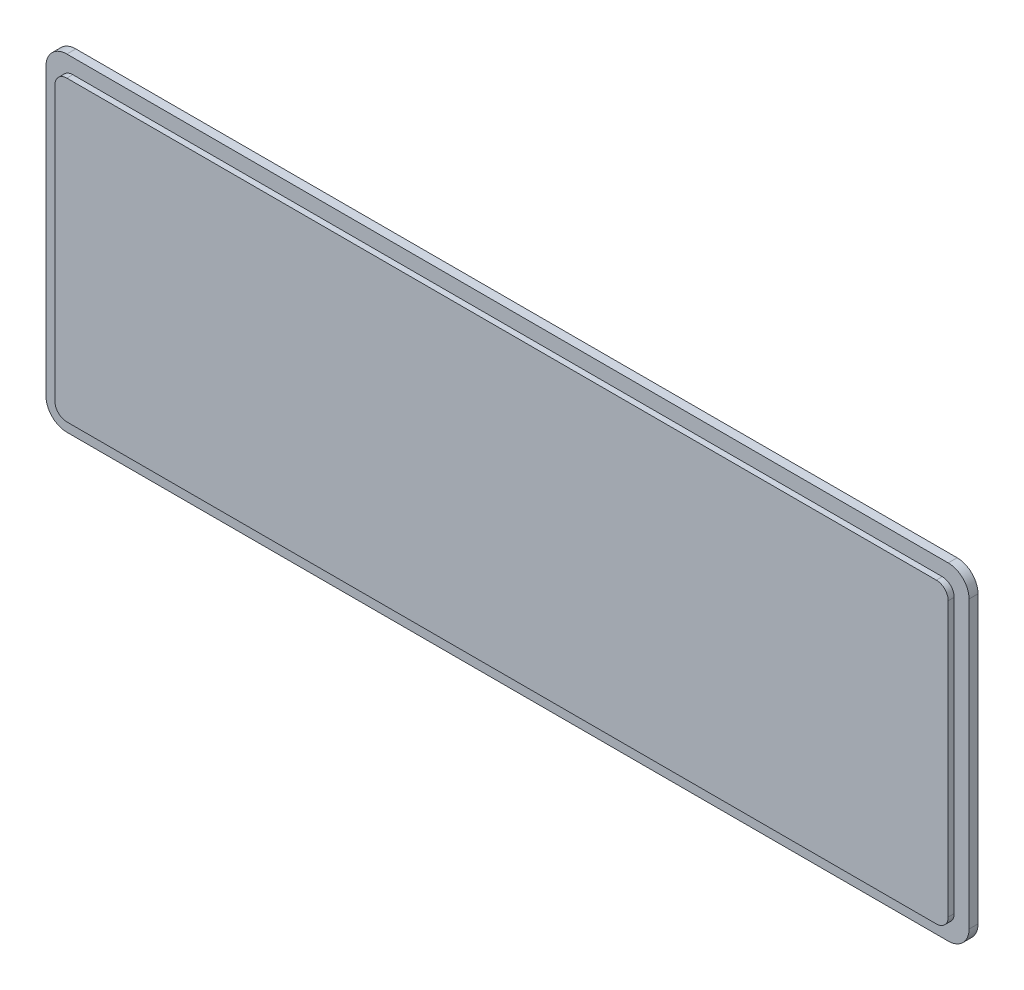
ISO-10303-21;
HEADER;
FILE_DESCRIPTION(('STEP AP214'),'2;1');
FILE_NAME('part.step','',(''),(''),'','','');
FILE_SCHEMA(('AUTOMOTIVE_DESIGN { 1 0 10303 214 1 1 1 1 }'));
ENDSEC;
DATA;
#1=APPLICATION_CONTEXT('core data for automotive mechanical design processes');
#2=APPLICATION_PROTOCOL_DEFINITION('international standard','automotive_design',2000,#1);
#3=PRODUCT_CONTEXT('',#1,'mechanical');
#4=PRODUCT('Part','Part','',(#3));
#5=PRODUCT_RELATED_PRODUCT_CATEGORY('part','',(#4));
#6=PRODUCT_DEFINITION_FORMATION('','',#4);
#7=PRODUCT_DEFINITION_CONTEXT('part definition',#1,'design');
#8=PRODUCT_DEFINITION('design','',#6,#7);
#9=PRODUCT_DEFINITION_SHAPE('','',#8);
#10=(LENGTH_UNIT() NAMED_UNIT(*) SI_UNIT(.MILLI.,.METRE.));
#11=(NAMED_UNIT(*) PLANE_ANGLE_UNIT() SI_UNIT($,.RADIAN.));
#12=(NAMED_UNIT(*) SI_UNIT($,.STERADIAN.) SOLID_ANGLE_UNIT());
#13=UNCERTAINTY_MEASURE_WITH_UNIT(LENGTH_MEASURE(1.E-05),#10,'distance_accuracy_value','');
#14=(GEOMETRIC_REPRESENTATION_CONTEXT(3) GLOBAL_UNCERTAINTY_ASSIGNED_CONTEXT((#13)) GLOBAL_UNIT_ASSIGNED_CONTEXT((#10,
#11,#12)) REPRESENTATION_CONTEXT('',''));
#15=CARTESIAN_POINT('',(0.,0.,0.));
#16=DIRECTION('',(0.,0.,1.));
#17=DIRECTION('',(1.,0.,0.));
#18=AXIS2_PLACEMENT_3D('',#15,#16,#17);
#19=CARTESIAN_POINT('',(0.,0.,1.5));
#20=DIRECTION('',(1.,0.,0.));
#21=DIRECTION('',(0.,1.,0.));
#22=AXIS2_PLACEMENT_3D('',#19,#20,#21);
#23=PLANE('',#22);
#24=DIRECTION('',(0.,-1.,0.));
#25=VECTOR('',#24,1.);
#26=CARTESIAN_POINT('',(0.,0.,0.));
#27=LINE('',#26,#25);
#28=CARTESIAN_POINT('',(0.,-3.5,0.));
#29=VERTEX_POINT('',#28);
#30=CARTESIAN_POINT('',(0.,-51.5,0.));
#31=VERTEX_POINT('',#30);
#32=EDGE_CURVE('E174',#29,#31,#27,.T.);
#33=ORIENTED_EDGE('',*,*,#32,.T.);
#34=DIRECTION('',(0.,0.,-1.));
#35=VECTOR('',#34,1.);
#36=CARTESIAN_POINT('',(0.,-51.5,1.5));
#37=LINE('',#36,#35);
#38=CARTESIAN_POINT('',(0.,-51.5,1.5));
#39=VERTEX_POINT('',#38);
#40=EDGE_CURVE('E152',#31,#39,#37,.F.);
#41=ORIENTED_EDGE('',*,*,#40,.T.);
#42=DIRECTION('',(0.,-1.,0.));
#43=VECTOR('',#42,1.);
#44=CARTESIAN_POINT('',(0.,0.,1.5));
#45=LINE('',#44,#43);
#46=CARTESIAN_POINT('',(0.,-3.5,1.5));
#47=VERTEX_POINT('',#46);
#48=EDGE_CURVE('E185',#47,#39,#45,.T.);
#49=ORIENTED_EDGE('',*,*,#48,.F.);
#50=DIRECTION('',(0.,0.,-1.));
#51=VECTOR('',#50,1.);
#52=CARTESIAN_POINT('',(0.,-3.5,1.5));
#53=LINE('',#52,#51);
#54=EDGE_CURVE('E157',#47,#29,#53,.T.);
#55=ORIENTED_EDGE('',*,*,#54,.T.);
#56=EDGE_LOOP('',(#33,#41,#49,#55));
#57=FACE_BOUND('',#56,.T.);
#58=ADVANCED_FACE('F35',(#57),#23,.F.);
#59=CARTESIAN_POINT('',(0.,-55.,1.5));
#60=DIRECTION('',(0.,1.,0.));
#61=DIRECTION('',(0.,0.,1.));
#62=AXIS2_PLACEMENT_3D('',#59,#60,#61);
#63=PLANE('',#62);
#64=DIRECTION('',(1.,0.,0.));
#65=VECTOR('',#64,1.);
#66=CARTESIAN_POINT('',(0.,-55.,1.5));
#67=LINE('',#66,#65);
#68=CARTESIAN_POINT('',(3.50000000000001,-55.,1.5));
#69=VERTEX_POINT('',#68);
#70=CARTESIAN_POINT('',(151.5,-55.,1.5));
#71=VERTEX_POINT('',#70);
#72=EDGE_CURVE('E167',#69,#71,#67,.T.);
#73=ORIENTED_EDGE('',*,*,#72,.F.);
#74=DIRECTION('',(0.,0.,-1.));
#75=VECTOR('',#74,1.);
#76=CARTESIAN_POINT('',(3.50000000000001,-55.,1.5));
#77=LINE('',#76,#75);
#78=CARTESIAN_POINT('',(3.50000000000001,-55.,0.));
#79=VERTEX_POINT('',#78);
#80=EDGE_CURVE('E151',#69,#79,#77,.T.);
#81=ORIENTED_EDGE('',*,*,#80,.T.);
#82=DIRECTION('',(1.,0.,0.));
#83=VECTOR('',#82,1.);
#84=CARTESIAN_POINT('',(0.,-55.,0.));
#85=LINE('',#84,#83);
#86=CARTESIAN_POINT('',(151.5,-55.,0.));
#87=VERTEX_POINT('',#86);
#88=EDGE_CURVE('E164',#79,#87,#85,.T.);
#89=ORIENTED_EDGE('',*,*,#88,.T.);
#90=DIRECTION('',(0.,0.,-1.));
#91=VECTOR('',#90,1.);
#92=CARTESIAN_POINT('',(151.5,-55.,1.5));
#93=LINE('',#92,#91);
#94=EDGE_CURVE('E169',#87,#71,#93,.F.);
#95=ORIENTED_EDGE('',*,*,#94,.T.);
#96=EDGE_LOOP('',(#73,#81,#89,#95));
#97=FACE_BOUND('',#96,.T.);
#98=ADVANCED_FACE('F163',(#97),#63,.F.);
#99=CARTESIAN_POINT('',(155.,0.,1.5));
#100=DIRECTION('',(-1.,0.,0.));
#101=DIRECTION('',(0.,0.,1.));
#102=AXIS2_PLACEMENT_3D('',#99,#100,#101);
#103=PLANE('',#102);
#104=DIRECTION('',(0.,1.,0.));
#105=VECTOR('',#104,1.);
#106=CARTESIAN_POINT('',(155.,0.,1.5));
#107=LINE('',#106,#105);
#108=CARTESIAN_POINT('',(155.,-51.5,1.5));
#109=VERTEX_POINT('',#108);
#110=CARTESIAN_POINT('',(155.,-3.5,1.5));
#111=VERTEX_POINT('',#110);
#112=EDGE_CURVE('E285',#109,#111,#107,.T.);
#113=ORIENTED_EDGE('',*,*,#112,.F.);
#114=DIRECTION('',(0.,0.,-1.));
#115=VECTOR('',#114,1.);
#116=CARTESIAN_POINT('',(155.,-51.5,1.5));
#117=LINE('',#116,#115);
#118=CARTESIAN_POINT('',(155.,-51.5,0.));
#119=VERTEX_POINT('',#118);
#120=EDGE_CURVE('E205',#109,#119,#117,.T.);
#121=ORIENTED_EDGE('',*,*,#120,.T.);
#122=DIRECTION('',(0.,1.,0.));
#123=VECTOR('',#122,1.);
#124=CARTESIAN_POINT('',(155.,0.,0.));
#125=LINE('',#124,#123);
#126=CARTESIAN_POINT('',(155.,-3.5,0.));
#127=VERTEX_POINT('',#126);
#128=EDGE_CURVE('E173',#119,#127,#125,.T.);
#129=ORIENTED_EDGE('',*,*,#128,.T.);
#130=DIRECTION('',(0.,0.,-1.));
#131=VECTOR('',#130,1.);
#132=CARTESIAN_POINT('',(155.,-3.5,1.5));
#133=LINE('',#132,#131);
#134=EDGE_CURVE('E203',#127,#111,#133,.F.);
#135=ORIENTED_EDGE('',*,*,#134,.T.);
#136=EDGE_LOOP('',(#113,#121,#129,#135));
#137=FACE_BOUND('',#136,.T.);
#138=ADVANCED_FACE('F306',(#137),#103,.F.);
#139=CARTESIAN_POINT('',(0.,0.,1.5));
#140=DIRECTION('',(0.,-1.,0.));
#141=DIRECTION('',(0.,0.,-1.));
#142=AXIS2_PLACEMENT_3D('',#139,#140,#141);
#143=PLANE('',#142);
#144=DIRECTION('',(-1.,0.,0.));
#145=VECTOR('',#144,1.);
#146=CARTESIAN_POINT('',(0.,0.,1.5));
#147=LINE('',#146,#145);
#148=CARTESIAN_POINT('',(151.5,0.,1.5));
#149=VERTEX_POINT('',#148);
#150=CARTESIAN_POINT('',(3.5,0.,1.5));
#151=VERTEX_POINT('',#150);
#152=EDGE_CURVE('E186',#149,#151,#147,.T.);
#153=ORIENTED_EDGE('',*,*,#152,.F.);
#154=DIRECTION('',(0.,0.,-1.));
#155=VECTOR('',#154,1.);
#156=CARTESIAN_POINT('',(151.5,0.,1.5));
#157=LINE('',#156,#155);
#158=CARTESIAN_POINT('',(151.5,0.,0.));
#159=VERTEX_POINT('',#158);
#160=EDGE_CURVE('E210',#149,#159,#157,.T.);
#161=ORIENTED_EDGE('',*,*,#160,.T.);
#162=DIRECTION('',(-1.,0.,0.));
#163=VECTOR('',#162,1.);
#164=CARTESIAN_POINT('',(0.,0.,0.));
#165=LINE('',#164,#163);
#166=CARTESIAN_POINT('',(3.5,0.,0.));
#167=VERTEX_POINT('',#166);
#168=EDGE_CURVE('E177',#159,#167,#165,.T.);
#169=ORIENTED_EDGE('',*,*,#168,.T.);
#170=DIRECTION('',(0.,0.,-1.));
#171=VECTOR('',#170,1.);
#172=CARTESIAN_POINT('',(3.5,0.,1.5));
#173=LINE('',#172,#171);
#174=EDGE_CURVE('E208',#167,#151,#173,.F.);
#175=ORIENTED_EDGE('',*,*,#174,.T.);
#176=EDGE_LOOP('',(#153,#161,#169,#175));
#177=FACE_BOUND('',#176,.T.);
#178=ADVANCED_FACE('F300',(#177),#143,.F.);
#179=CARTESIAN_POINT('',(0.,0.,1.5));
#180=DIRECTION('',(0.,0.,1.));
#181=DIRECTION('',(1.,0.,0.));
#182=AXIS2_PLACEMENT_3D('',#179,#180,#181);
#183=PLANE('',#182);
#184=DIRECTION('',(0.,-1.,0.));
#185=VECTOR('',#184,1.);
#186=CARTESIAN_POINT('',(2.5,-2.5,1.5));
#187=LINE('',#186,#185);
#188=CARTESIAN_POINT('',(2.5,-4.5,1.5));
#189=VERTEX_POINT('',#188);
#190=CARTESIAN_POINT('',(2.5,-50.5,1.5));
#191=VERTEX_POINT('',#190);
#192=EDGE_CURVE('E247',#189,#191,#187,.T.);
#193=ORIENTED_EDGE('',*,*,#192,.F.);
#194=CARTESIAN_POINT('',(4.5,-4.5,1.5));
#195=DIRECTION('',(0.,0.,1.));
#196=DIRECTION('',(1.,0.,0.));
#197=AXIS2_PLACEMENT_3D('',#194,#195,#196);
#198=CIRCLE('',#197,2.);
#199=CARTESIAN_POINT('',(4.5,-2.5,1.5));
#200=VERTEX_POINT('',#199);
#201=EDGE_CURVE('E242',#189,#200,#198,.F.);
#202=ORIENTED_EDGE('',*,*,#201,.T.);
#203=DIRECTION('',(-1.,0.,0.));
#204=VECTOR('',#203,1.);
#205=CARTESIAN_POINT('',(2.5,-2.5,1.5));
#206=LINE('',#205,#204);
#207=CARTESIAN_POINT('',(150.5,-2.5,1.5));
#208=VERTEX_POINT('',#207);
#209=EDGE_CURVE('E271',#208,#200,#206,.T.);
#210=ORIENTED_EDGE('',*,*,#209,.F.);
#211=CARTESIAN_POINT('',(150.5,-4.5,1.5));
#212=DIRECTION('',(0.,0.,1.));
#213=DIRECTION('',(1.,0.,0.));
#214=AXIS2_PLACEMENT_3D('',#211,#212,#213);
#215=CIRCLE('',#214,2.);
#216=CARTESIAN_POINT('',(152.5,-4.5,1.5));
#217=VERTEX_POINT('',#216);
#218=EDGE_CURVE('E240',#208,#217,#215,.F.);
#219=ORIENTED_EDGE('',*,*,#218,.T.);
#220=DIRECTION('',(0.,1.,0.));
#221=VECTOR('',#220,1.);
#222=CARTESIAN_POINT('',(152.5,-2.5,1.5));
#223=LINE('',#222,#221);
#224=CARTESIAN_POINT('',(152.5,-50.5,1.5));
#225=VERTEX_POINT('',#224);
#226=EDGE_CURVE('E277',#225,#217,#223,.T.);
#227=ORIENTED_EDGE('',*,*,#226,.F.);
#228=CARTESIAN_POINT('',(150.5,-50.5,1.5));
#229=DIRECTION('',(0.,0.,1.));
#230=DIRECTION('',(1.,0.,0.));
#231=AXIS2_PLACEMENT_3D('',#228,#229,#230);
#232=CIRCLE('',#231,2.);
#233=CARTESIAN_POINT('',(150.5,-52.5,1.5));
#234=VERTEX_POINT('',#233);
#235=EDGE_CURVE('E11',#225,#234,#232,.F.);
#236=ORIENTED_EDGE('',*,*,#235,.T.);
#237=DIRECTION('',(1.,0.,0.));
#238=VECTOR('',#237,1.);
#239=CARTESIAN_POINT('',(2.5,-52.5,1.5));
#240=LINE('',#239,#238);
#241=CARTESIAN_POINT('',(4.5,-52.5,1.5));
#242=VERTEX_POINT('',#241);
#243=EDGE_CURVE('E248',#242,#234,#240,.T.);
#244=ORIENTED_EDGE('',*,*,#243,.F.);
#245=CARTESIAN_POINT('',(4.5,-50.5,1.5));
#246=DIRECTION('',(0.,0.,1.));
#247=DIRECTION('',(1.,0.,0.));
#248=AXIS2_PLACEMENT_3D('',#245,#246,#247);
#249=CIRCLE('',#248,2.);
#250=EDGE_CURVE('E43',#242,#191,#249,.F.);
#251=ORIENTED_EDGE('',*,*,#250,.T.);
#252=EDGE_LOOP('',(#193,#202,#210,#219,#227,#236,#244,#251));
#253=FACE_BOUND('',#252,.T.);
#254=ORIENTED_EDGE('',*,*,#48,.T.);
#255=CARTESIAN_POINT('',(3.50000000000001,-51.5,1.5));
#256=DIRECTION('',(0.,0.,1.));
#257=DIRECTION('',(1.,0.,0.));
#258=AXIS2_PLACEMENT_3D('',#255,#256,#257);
#259=CIRCLE('',#258,3.5);
#260=EDGE_CURVE('E201',#39,#69,#259,.T.);
#261=ORIENTED_EDGE('',*,*,#260,.T.);
#262=ORIENTED_EDGE('',*,*,#72,.T.);
#263=CARTESIAN_POINT('',(151.5,-51.5,1.5));
#264=DIRECTION('',(0.,0.,1.));
#265=DIRECTION('',(1.,0.,0.));
#266=AXIS2_PLACEMENT_3D('',#263,#264,#265);
#267=CIRCLE('',#266,3.5);
#268=EDGE_CURVE('E199',#71,#109,#267,.T.);
#269=ORIENTED_EDGE('',*,*,#268,.T.);
#270=ORIENTED_EDGE('',*,*,#112,.T.);
#271=CARTESIAN_POINT('',(151.5,-3.5,1.5));
#272=DIRECTION('',(0.,0.,1.));
#273=DIRECTION('',(1.,0.,0.));
#274=AXIS2_PLACEMENT_3D('',#271,#272,#273);
#275=CIRCLE('',#274,3.5);
#276=EDGE_CURVE('E197',#111,#149,#275,.T.);
#277=ORIENTED_EDGE('',*,*,#276,.T.);
#278=ORIENTED_EDGE('',*,*,#152,.T.);
#279=CARTESIAN_POINT('',(3.5,-3.5,1.5));
#280=DIRECTION('',(0.,0.,1.));
#281=DIRECTION('',(1.,0.,0.));
#282=AXIS2_PLACEMENT_3D('',#279,#280,#281);
#283=CIRCLE('',#282,3.5);
#284=EDGE_CURVE('E195',#151,#47,#283,.T.);
#285=ORIENTED_EDGE('',*,*,#284,.T.);
#286=EDGE_LOOP('',(#254,#261,#262,#269,#270,#277,#278,#285));
#287=FACE_BOUND('',#286,.T.);
#288=ADVANCED_FACE('F245',(#253,#287),#183,.T.);
#289=CARTESIAN_POINT('',(0.,0.,0.));
#290=DIRECTION('',(0.,0.,1.));
#291=DIRECTION('',(1.,0.,0.));
#292=AXIS2_PLACEMENT_3D('',#289,#290,#291);
#293=PLANE('',#292);
#294=ORIENTED_EDGE('',*,*,#88,.F.);
#295=CARTESIAN_POINT('',(3.50000000000001,-51.5,0.));
#296=DIRECTION('',(0.,0.,1.));
#297=DIRECTION('',(1.,0.,0.));
#298=AXIS2_PLACEMENT_3D('',#295,#296,#297);
#299=CIRCLE('',#298,3.5);
#300=EDGE_CURVE('E147',#79,#31,#299,.F.);
#301=ORIENTED_EDGE('',*,*,#300,.T.);
#302=ORIENTED_EDGE('',*,*,#32,.F.);
#303=CARTESIAN_POINT('',(3.5,-3.5,0.));
#304=DIRECTION('',(0.,0.,1.));
#305=DIRECTION('',(1.,0.,0.));
#306=AXIS2_PLACEMENT_3D('',#303,#304,#305);
#307=CIRCLE('',#306,3.5);
#308=EDGE_CURVE('E168',#29,#167,#307,.F.);
#309=ORIENTED_EDGE('',*,*,#308,.T.);
#310=ORIENTED_EDGE('',*,*,#168,.F.);
#311=CARTESIAN_POINT('',(151.5,-3.5,0.));
#312=DIRECTION('',(0.,0.,1.));
#313=DIRECTION('',(1.,0.,0.));
#314=AXIS2_PLACEMENT_3D('',#311,#312,#313);
#315=CIRCLE('',#314,3.5);
#316=EDGE_CURVE('E189',#159,#127,#315,.F.);
#317=ORIENTED_EDGE('',*,*,#316,.T.);
#318=ORIENTED_EDGE('',*,*,#128,.F.);
#319=CARTESIAN_POINT('',(151.5,-51.5,0.));
#320=DIRECTION('',(0.,0.,1.));
#321=DIRECTION('',(1.,0.,0.));
#322=AXIS2_PLACEMENT_3D('',#319,#320,#321);
#323=CIRCLE('',#322,3.5);
#324=EDGE_CURVE('E158',#119,#87,#323,.F.);
#325=ORIENTED_EDGE('',*,*,#324,.T.);
#326=EDGE_LOOP('',(#294,#301,#302,#309,#310,#317,#318,#325));
#327=FACE_BOUND('',#326,.T.);
#328=ADVANCED_FACE('F171',(#327),#293,.F.);
#329=CARTESIAN_POINT('',(3.50000000000001,-51.5,1.5));
#330=DIRECTION('',(0.,0.,-1.));
#331=DIRECTION('',(-1.,0.,0.));
#332=AXIS2_PLACEMENT_3D('',#329,#330,#331);
#333=CYLINDRICAL_SURFACE('',#332,3.5);
#334=ORIENTED_EDGE('',*,*,#260,.F.);
#335=ORIENTED_EDGE('',*,*,#40,.F.);
#336=ORIENTED_EDGE('',*,*,#300,.F.);
#337=ORIENTED_EDGE('',*,*,#80,.F.);
#338=EDGE_LOOP('',(#334,#335,#336,#337));
#339=FACE_BOUND('',#338,.T.);
#340=ADVANCED_FACE('F150',(#339),#333,.T.);
#341=CARTESIAN_POINT('',(151.5,-51.5,1.5));
#342=DIRECTION('',(0.,0.,-1.));
#343=DIRECTION('',(-1.,0.,0.));
#344=AXIS2_PLACEMENT_3D('',#341,#342,#343);
#345=CYLINDRICAL_SURFACE('',#344,3.5);
#346=ORIENTED_EDGE('',*,*,#268,.F.);
#347=ORIENTED_EDGE('',*,*,#94,.F.);
#348=ORIENTED_EDGE('',*,*,#324,.F.);
#349=ORIENTED_EDGE('',*,*,#120,.F.);
#350=EDGE_LOOP('',(#346,#347,#348,#349));
#351=FACE_BOUND('',#350,.T.);
#352=ADVANCED_FACE('F310',(#351),#345,.T.);
#353=CARTESIAN_POINT('',(151.5,-3.5,1.5));
#354=DIRECTION('',(0.,0.,-1.));
#355=DIRECTION('',(-1.,0.,0.));
#356=AXIS2_PLACEMENT_3D('',#353,#354,#355);
#357=CYLINDRICAL_SURFACE('',#356,3.5);
#358=ORIENTED_EDGE('',*,*,#276,.F.);
#359=ORIENTED_EDGE('',*,*,#134,.F.);
#360=ORIENTED_EDGE('',*,*,#316,.F.);
#361=ORIENTED_EDGE('',*,*,#160,.F.);
#362=EDGE_LOOP('',(#358,#359,#360,#361));
#363=FACE_BOUND('',#362,.T.);
#364=ADVANCED_FACE('F302',(#363),#357,.T.);
#365=CARTESIAN_POINT('',(3.5,-3.5,1.5));
#366=DIRECTION('',(0.,0.,-1.));
#367=DIRECTION('',(-1.,0.,0.));
#368=AXIS2_PLACEMENT_3D('',#365,#366,#367);
#369=CYLINDRICAL_SURFACE('',#368,3.5);
#370=ORIENTED_EDGE('',*,*,#284,.F.);
#371=ORIENTED_EDGE('',*,*,#174,.F.);
#372=ORIENTED_EDGE('',*,*,#308,.F.);
#373=ORIENTED_EDGE('',*,*,#54,.F.);
#374=EDGE_LOOP('',(#370,#371,#372,#373));
#375=FACE_BOUND('',#374,.T.);
#376=ADVANCED_FACE('F297',(#375),#369,.T.);
#377=CARTESIAN_POINT('',(2.5,-2.5,2.5));
#378=DIRECTION('',(1.,0.,0.));
#379=DIRECTION('',(0.,1.,0.));
#380=AXIS2_PLACEMENT_3D('',#377,#378,#379);
#381=PLANE('',#380);
#382=DIRECTION('',(0.,-1.,0.));
#383=VECTOR('',#382,1.);
#384=CARTESIAN_POINT('',(2.5,-2.5,2.5));
#385=LINE('',#384,#383);
#386=CARTESIAN_POINT('',(2.5,-4.5,2.5));
#387=VERTEX_POINT('',#386);
#388=CARTESIAN_POINT('',(2.5,-50.5,2.5));
#389=VERTEX_POINT('',#388);
#390=EDGE_CURVE('E264',#387,#389,#385,.T.);
#391=ORIENTED_EDGE('',*,*,#390,.F.);
#392=DIRECTION('',(0.,0.,-1.));
#393=VECTOR('',#392,1.);
#394=CARTESIAN_POINT('',(2.5,-4.5,2.5));
#395=LINE('',#394,#393);
#396=EDGE_CURVE('E233',#387,#189,#395,.T.);
#397=ORIENTED_EDGE('',*,*,#396,.T.);
#398=ORIENTED_EDGE('',*,*,#192,.T.);
#399=DIRECTION('',(0.,0.,-1.));
#400=VECTOR('',#399,1.);
#401=CARTESIAN_POINT('',(2.5,-50.5,2.5));
#402=LINE('',#401,#400);
#403=EDGE_CURVE('E231',#191,#389,#402,.F.);
#404=ORIENTED_EDGE('',*,*,#403,.T.);
#405=EDGE_LOOP('',(#391,#397,#398,#404));
#406=FACE_BOUND('',#405,.T.);
#407=ADVANCED_FACE('F251',(#406),#381,.F.);
#408=CARTESIAN_POINT('',(2.5,-52.5,2.5));
#409=DIRECTION('',(0.,1.,0.));
#410=DIRECTION('',(0.,0.,1.));
#411=AXIS2_PLACEMENT_3D('',#408,#409,#410);
#412=PLANE('',#411);
#413=DIRECTION('',(1.,0.,0.));
#414=VECTOR('',#413,1.);
#415=CARTESIAN_POINT('',(2.5,-52.5,2.5));
#416=LINE('',#415,#414);
#417=CARTESIAN_POINT('',(4.5,-52.5,2.5));
#418=VERTEX_POINT('',#417);
#419=CARTESIAN_POINT('',(150.5,-52.5,2.5));
#420=VERTEX_POINT('',#419);
#421=EDGE_CURVE('E262',#418,#420,#416,.T.);
#422=ORIENTED_EDGE('',*,*,#421,.F.);
#423=DIRECTION('',(0.,0.,-1.));
#424=VECTOR('',#423,1.);
#425=CARTESIAN_POINT('',(4.5,-52.5,2.5));
#426=LINE('',#425,#424);
#427=EDGE_CURVE('E238',#418,#242,#426,.T.);
#428=ORIENTED_EDGE('',*,*,#427,.T.);
#429=ORIENTED_EDGE('',*,*,#243,.T.);
#430=DIRECTION('',(0.,0.,-1.));
#431=VECTOR('',#430,1.);
#432=CARTESIAN_POINT('',(150.5,-52.5,2.5));
#433=LINE('',#432,#431);
#434=EDGE_CURVE('E236',#234,#420,#433,.F.);
#435=ORIENTED_EDGE('',*,*,#434,.T.);
#436=EDGE_LOOP('',(#422,#428,#429,#435));
#437=FACE_BOUND('',#436,.T.);
#438=ADVANCED_FACE('F266',(#437),#412,.F.);
#439=CARTESIAN_POINT('',(152.5,-2.5,2.5));
#440=DIRECTION('',(-1.,0.,0.));
#441=DIRECTION('',(0.,0.,1.));
#442=AXIS2_PLACEMENT_3D('',#439,#440,#441);
#443=PLANE('',#442);
#444=ORIENTED_EDGE('',*,*,#226,.T.);
#445=DIRECTION('',(0.,0.,-1.));
#446=VECTOR('',#445,1.);
#447=CARTESIAN_POINT('',(152.5,-4.5,2.5));
#448=LINE('',#447,#446);
#449=CARTESIAN_POINT('',(152.5,-4.5,2.5));
#450=VERTEX_POINT('',#449);
#451=EDGE_CURVE('E221',#217,#450,#448,.F.);
#452=ORIENTED_EDGE('',*,*,#451,.T.);
#453=DIRECTION('',(0.,1.,0.));
#454=VECTOR('',#453,1.);
#455=CARTESIAN_POINT('',(152.5,-2.5,2.5));
#456=LINE('',#455,#454);
#457=CARTESIAN_POINT('',(152.5,-50.5,2.5));
#458=VERTEX_POINT('',#457);
#459=EDGE_CURVE('E268',#458,#450,#456,.T.);
#460=ORIENTED_EDGE('',*,*,#459,.F.);
#461=DIRECTION('',(0.,0.,-1.));
#462=VECTOR('',#461,1.);
#463=CARTESIAN_POINT('',(152.5,-50.5,2.5));
#464=LINE('',#463,#462);
#465=EDGE_CURVE('E218',#458,#225,#464,.T.);
#466=ORIENTED_EDGE('',*,*,#465,.T.);
#467=EDGE_LOOP('',(#444,#452,#460,#466));
#468=FACE_BOUND('',#467,.T.);
#469=ADVANCED_FACE('F338',(#468),#443,.F.);
#470=CARTESIAN_POINT('',(2.5,-2.5,2.5));
#471=DIRECTION('',(0.,-1.,0.));
#472=DIRECTION('',(0.,0.,-1.));
#473=AXIS2_PLACEMENT_3D('',#470,#471,#472);
#474=PLANE('',#473);
#475=DIRECTION('',(-1.,0.,0.));
#476=VECTOR('',#475,1.);
#477=CARTESIAN_POINT('',(2.5,-2.5,2.5));
#478=LINE('',#477,#476);
#479=CARTESIAN_POINT('',(150.5,-2.5,2.5));
#480=VERTEX_POINT('',#479);
#481=CARTESIAN_POINT('',(4.5,-2.5,2.5));
#482=VERTEX_POINT('',#481);
#483=EDGE_CURVE('E179',#480,#482,#478,.T.);
#484=ORIENTED_EDGE('',*,*,#483,.F.);
#485=DIRECTION('',(0.,0.,-1.));
#486=VECTOR('',#485,1.);
#487=CARTESIAN_POINT('',(150.5,-2.5,2.5));
#488=LINE('',#487,#486);
#489=EDGE_CURVE('E215',#480,#208,#488,.T.);
#490=ORIENTED_EDGE('',*,*,#489,.T.);
#491=ORIENTED_EDGE('',*,*,#209,.T.);
#492=DIRECTION('',(0.,0.,-1.));
#493=VECTOR('',#492,1.);
#494=CARTESIAN_POINT('',(4.5,-2.5,2.5));
#495=LINE('',#494,#493);
#496=EDGE_CURVE('E213',#200,#482,#495,.F.);
#497=ORIENTED_EDGE('',*,*,#496,.T.);
#498=EDGE_LOOP('',(#484,#490,#491,#497));
#499=FACE_BOUND('',#498,.T.);
#500=ADVANCED_FACE('F341',(#499),#474,.F.);
#501=CARTESIAN_POINT('',(0.,0.,2.5));
#502=DIRECTION('',(0.,0.,1.));
#503=DIRECTION('',(1.,0.,0.));
#504=AXIS2_PLACEMENT_3D('',#501,#502,#503);
#505=PLANE('',#504);
#506=ORIENTED_EDGE('',*,*,#459,.T.);
#507=CARTESIAN_POINT('',(150.5,-4.5,2.5));
#508=DIRECTION('',(0.,0.,1.));
#509=DIRECTION('',(1.,0.,0.));
#510=AXIS2_PLACEMENT_3D('',#507,#508,#509);
#511=CIRCLE('',#510,2.);
#512=EDGE_CURVE('E229',#450,#480,#511,.T.);
#513=ORIENTED_EDGE('',*,*,#512,.T.);
#514=ORIENTED_EDGE('',*,*,#483,.T.);
#515=CARTESIAN_POINT('',(4.5,-4.5,2.5));
#516=DIRECTION('',(0.,0.,1.));
#517=DIRECTION('',(1.,0.,0.));
#518=AXIS2_PLACEMENT_3D('',#515,#516,#517);
#519=CIRCLE('',#518,2.);
#520=EDGE_CURVE('E227',#482,#387,#519,.T.);
#521=ORIENTED_EDGE('',*,*,#520,.T.);
#522=ORIENTED_EDGE('',*,*,#390,.T.);
#523=CARTESIAN_POINT('',(4.5,-50.5,2.5));
#524=DIRECTION('',(0.,0.,1.));
#525=DIRECTION('',(1.,0.,0.));
#526=AXIS2_PLACEMENT_3D('',#523,#524,#525);
#527=CIRCLE('',#526,2.);
#528=EDGE_CURVE('E225',#389,#418,#527,.T.);
#529=ORIENTED_EDGE('',*,*,#528,.T.);
#530=ORIENTED_EDGE('',*,*,#421,.T.);
#531=CARTESIAN_POINT('',(150.5,-50.5,2.5));
#532=DIRECTION('',(0.,0.,1.));
#533=DIRECTION('',(1.,0.,0.));
#534=AXIS2_PLACEMENT_3D('',#531,#532,#533);
#535=CIRCLE('',#534,2.);
#536=EDGE_CURVE('E223',#420,#458,#535,.T.);
#537=ORIENTED_EDGE('',*,*,#536,.T.);
#538=EDGE_LOOP('',(#506,#513,#514,#521,#522,#529,#530,#537));
#539=FACE_BOUND('',#538,.T.);
#540=ADVANCED_FACE('F261',(#539),#505,.T.);
#541=CARTESIAN_POINT('',(150.5,-4.5,2.5));
#542=DIRECTION('',(0.,0.,-1.));
#543=DIRECTION('',(-1.,0.,0.));
#544=AXIS2_PLACEMENT_3D('',#541,#542,#543);
#545=CYLINDRICAL_SURFACE('',#544,2.);
#546=ORIENTED_EDGE('',*,*,#512,.F.);
#547=ORIENTED_EDGE('',*,*,#451,.F.);
#548=ORIENTED_EDGE('',*,*,#218,.F.);
#549=ORIENTED_EDGE('',*,*,#489,.F.);
#550=EDGE_LOOP('',(#546,#547,#548,#549));
#551=FACE_BOUND('',#550,.T.);
#552=ADVANCED_FACE('F347',(#551),#545,.T.);
#553=CARTESIAN_POINT('',(4.5,-4.5,2.5));
#554=DIRECTION('',(0.,0.,-1.));
#555=DIRECTION('',(-1.,0.,0.));
#556=AXIS2_PLACEMENT_3D('',#553,#554,#555);
#557=CYLINDRICAL_SURFACE('',#556,2.);
#558=ORIENTED_EDGE('',*,*,#520,.F.);
#559=ORIENTED_EDGE('',*,*,#496,.F.);
#560=ORIENTED_EDGE('',*,*,#201,.F.);
#561=ORIENTED_EDGE('',*,*,#396,.F.);
#562=EDGE_LOOP('',(#558,#559,#560,#561));
#563=FACE_BOUND('',#562,.T.);
#564=ADVANCED_FACE('F351',(#563),#557,.T.);
#565=CARTESIAN_POINT('',(4.5,-50.5,2.5));
#566=DIRECTION('',(0.,0.,-1.));
#567=DIRECTION('',(-1.,0.,0.));
#568=AXIS2_PLACEMENT_3D('',#565,#566,#567);
#569=CYLINDRICAL_SURFACE('',#568,2.);
#570=ORIENTED_EDGE('',*,*,#528,.F.);
#571=ORIENTED_EDGE('',*,*,#403,.F.);
#572=ORIENTED_EDGE('',*,*,#250,.F.);
#573=ORIENTED_EDGE('',*,*,#427,.F.);
#574=EDGE_LOOP('',(#570,#571,#572,#573));
#575=FACE_BOUND('',#574,.T.);
#576=ADVANCED_FACE('F256',(#575),#569,.T.);
#577=CARTESIAN_POINT('',(150.5,-50.5,2.5));
#578=DIRECTION('',(0.,0.,-1.));
#579=DIRECTION('',(-1.,0.,0.));
#580=AXIS2_PLACEMENT_3D('',#577,#578,#579);
#581=CYLINDRICAL_SURFACE('',#580,2.);
#582=ORIENTED_EDGE('',*,*,#536,.F.);
#583=ORIENTED_EDGE('',*,*,#434,.F.);
#584=ORIENTED_EDGE('',*,*,#235,.F.);
#585=ORIENTED_EDGE('',*,*,#465,.F.);
#586=EDGE_LOOP('',(#582,#583,#584,#585));
#587=FACE_BOUND('',#586,.T.);
#588=ADVANCED_FACE('F37',(#587),#581,.T.);
#589=CLOSED_SHELL('',(#58,#98,#138,#178,#288,#328,#340,#352,#364,#376,#407,#438,#469,#500,#540,
#552,#564,#576,#588));
#590=MANIFOLD_SOLID_BREP('B2',#589);
#591=ADVANCED_BREP_SHAPE_REPRESENTATION('',(#18,#590),#14);
#592=SHAPE_DEFINITION_REPRESENTATION(#9,#591);
ENDSEC;
END-ISO-10303-21;
